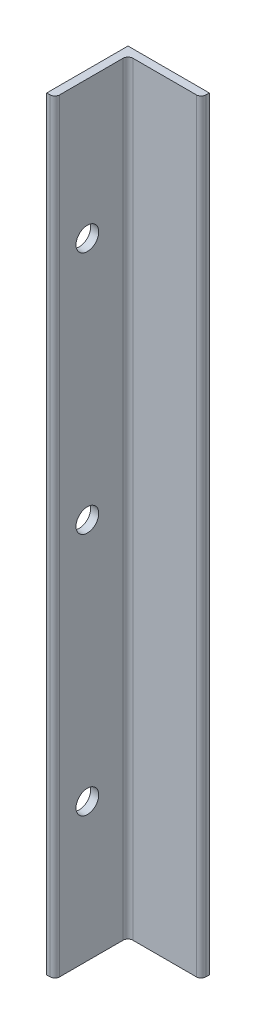
ISO-10303-21;
HEADER;
FILE_DESCRIPTION(('STEP AP214'),'2;1');
FILE_NAME('part.step','',(''),(''),'','','');
FILE_SCHEMA(('AUTOMOTIVE_DESIGN { 1 0 10303 214 1 1 1 1 }'));
ENDSEC;
DATA;
#1=APPLICATION_CONTEXT('core data for automotive mechanical design processes');
#2=APPLICATION_PROTOCOL_DEFINITION('international standard','automotive_design',2000,#1);
#3=PRODUCT_CONTEXT('',#1,'mechanical');
#4=PRODUCT('Part','Part','',(#3));
#5=PRODUCT_RELATED_PRODUCT_CATEGORY('part','',(#4));
#6=PRODUCT_DEFINITION_FORMATION('','',#4);
#7=PRODUCT_DEFINITION_CONTEXT('part definition',#1,'design');
#8=PRODUCT_DEFINITION('design','',#6,#7);
#9=PRODUCT_DEFINITION_SHAPE('','',#8);
#10=(LENGTH_UNIT() NAMED_UNIT(*) SI_UNIT(.MILLI.,.METRE.));
#11=(NAMED_UNIT(*) PLANE_ANGLE_UNIT() SI_UNIT($,.RADIAN.));
#12=(NAMED_UNIT(*) SI_UNIT($,.STERADIAN.) SOLID_ANGLE_UNIT());
#13=UNCERTAINTY_MEASURE_WITH_UNIT(LENGTH_MEASURE(1.E-05),#10,'distance_accuracy_value','');
#14=(GEOMETRIC_REPRESENTATION_CONTEXT(3) GLOBAL_UNCERTAINTY_ASSIGNED_CONTEXT((#13)) GLOBAL_UNIT_ASSIGNED_CONTEXT((#10,
#11,#12)) REPRESENTATION_CONTEXT('',''));
#15=CARTESIAN_POINT('',(0.,0.,0.));
#16=DIRECTION('',(0.,0.,1.));
#17=DIRECTION('',(1.,0.,0.));
#18=AXIS2_PLACEMENT_3D('',#15,#16,#17);
#19=CARTESIAN_POINT('',(-18.4998721449561,470.,-37.2131532770167));
#20=DIRECTION('',(-1.,0.,0.));
#21=DIRECTION('',(0.,0.,1.));
#22=AXIS2_PLACEMENT_3D('',#19,#20,#21);
#23=PLANE('',#22);
#24=DIRECTION('',(0.,0.,-1.));
#25=VECTOR('',#24,1.);
#26=CARTESIAN_POINT('',(-18.4998721449561,0.,-37.2131532770166));
#27=LINE('',#26,#25);
#28=CARTESIAN_POINT('',(-18.4998721449561,0.,-37.2131532770166));
#29=VERTEX_POINT('',#28);
#30=CARTESIAN_POINT('',(-18.4998721449561,0.,-39.2131532770166));
#31=VERTEX_POINT('',#30);
#32=EDGE_CURVE('E148',#29,#31,#27,.T.);
#33=ORIENTED_EDGE('',*,*,#32,.T.);
#34=DIRECTION('',(0.,-1.,0.));
#35=VECTOR('',#34,1.);
#36=CARTESIAN_POINT('',(-18.4998721449561,470.,-39.2131532770167));
#37=LINE('',#36,#35);
#38=CARTESIAN_POINT('',(-18.4998721449561,470.,-39.2131532770167));
#39=VERTEX_POINT('',#38);
#40=EDGE_CURVE('E13',#39,#31,#37,.T.);
#41=ORIENTED_EDGE('',*,*,#40,.F.);
#42=DIRECTION('',(0.,0.,-1.));
#43=VECTOR('',#42,1.);
#44=CARTESIAN_POINT('',(-18.4998721449561,470.,-37.2131532770167));
#45=LINE('',#44,#43);
#46=CARTESIAN_POINT('',(-18.4998721449561,470.,-37.2131532770167));
#47=VERTEX_POINT('',#46);
#48=EDGE_CURVE('E165',#47,#39,#45,.T.);
#49=ORIENTED_EDGE('',*,*,#48,.F.);
#50=DIRECTION('',(0.,-1.,0.));
#51=VECTOR('',#50,1.);
#52=CARTESIAN_POINT('',(-18.4998721449561,470.,-37.2131532770167));
#53=LINE('',#52,#51);
#54=EDGE_CURVE('E144',#47,#29,#53,.T.);
#55=ORIENTED_EDGE('',*,*,#54,.T.);
#56=EDGE_LOOP('',(#33,#41,#49,#55));
#57=FACE_BOUND('',#56,.T.);
#58=ADVANCED_FACE('F46',(#57),#23,.F.);
#59=CARTESIAN_POINT('',(-18.4998721449561,470.,-39.2131532770167));
#60=DIRECTION('',(0.,0.,1.));
#61=DIRECTION('',(1.,0.,0.));
#62=AXIS2_PLACEMENT_3D('',#59,#60,#61);
#63=PLANE('',#62);
#64=DIRECTION('',(-1.,0.,0.));
#65=VECTOR('',#64,1.);
#66=CARTESIAN_POINT('',(-18.4998721449561,0.,-39.2131532770166));
#67=LINE('',#66,#65);
#68=CARTESIAN_POINT('',(-68.4998721449561,0.,-39.2131532770166));
#69=VERTEX_POINT('',#68);
#70=EDGE_CURVE('E151',#31,#69,#67,.T.);
#71=ORIENTED_EDGE('',*,*,#70,.T.);
#72=DIRECTION('',(0.,-1.,0.));
#73=VECTOR('',#72,1.);
#74=CARTESIAN_POINT('',(-68.4998721449561,470.,-39.2131532770167));
#75=LINE('',#74,#73);
#76=CARTESIAN_POINT('',(-68.4998721449561,470.,-39.2131532770167));
#77=VERTEX_POINT('',#76);
#78=EDGE_CURVE('E54',#77,#69,#75,.T.);
#79=ORIENTED_EDGE('',*,*,#78,.F.);
#80=DIRECTION('',(-1.,0.,0.));
#81=VECTOR('',#80,1.);
#82=CARTESIAN_POINT('',(-18.4998721449561,470.,-39.2131532770167));
#83=LINE('',#82,#81);
#84=EDGE_CURVE('E108',#39,#77,#83,.T.);
#85=ORIENTED_EDGE('',*,*,#84,.F.);
#86=ORIENTED_EDGE('',*,*,#40,.T.);
#87=EDGE_LOOP('',(#71,#79,#85,#86));
#88=FACE_BOUND('',#87,.T.);
#89=ADVANCED_FACE('F248',(#88),#63,.F.);
#90=CARTESIAN_POINT('',(-68.4998721449561,470.,-39.2131532770167));
#91=DIRECTION('',(1.,0.,0.));
#92=DIRECTION('',(0.,0.,-1.));
#93=AXIS2_PLACEMENT_3D('',#90,#91,#92);
#94=PLANE('',#93);
#95=CARTESIAN_POINT('',(-68.4998721449561,385.,-9.21315327701661));
#96=DIRECTION('',(1.,0.,0.));
#97=DIRECTION('',(0.,0.,-1.));
#98=AXIS2_PLACEMENT_3D('',#95,#96,#97);
#99=CIRCLE('',#98,7.00000000000002);
#100=CARTESIAN_POINT('',(-68.4998721449561,385.,-16.2131532770166));
#101=VERTEX_POINT('',#100);
#102=EDGE_CURVE('E152',#101,#101,#99,.T.);
#103=ORIENTED_EDGE('',*,*,#102,.T.);
#104=EDGE_LOOP('',(#103));
#105=FACE_BOUND('',#104,.T.);
#106=CARTESIAN_POINT('',(-68.4998721449561,85.,-9.21315327701666));
#107=DIRECTION('',(1.,0.,0.));
#108=DIRECTION('',(0.,0.,-1.));
#109=AXIS2_PLACEMENT_3D('',#106,#107,#108);
#110=CIRCLE('',#109,7.);
#111=CARTESIAN_POINT('',(-68.4998721449561,85.,-16.2131532770167));
#112=VERTEX_POINT('',#111);
#113=EDGE_CURVE('E208',#112,#112,#110,.T.);
#114=ORIENTED_EDGE('',*,*,#113,.T.);
#115=EDGE_LOOP('',(#114));
#116=FACE_BOUND('',#115,.T.);
#117=CARTESIAN_POINT('',(-68.4998721449561,235.,-9.21315327701661));
#118=DIRECTION('',(1.,0.,0.));
#119=DIRECTION('',(0.,0.,-1.));
#120=AXIS2_PLACEMENT_3D('',#117,#118,#119);
#121=CIRCLE('',#120,7.00000000000002);
#122=CARTESIAN_POINT('',(-68.4998721449561,235.,-16.2131532770166));
#123=VERTEX_POINT('',#122);
#124=EDGE_CURVE('E211',#123,#123,#121,.T.);
#125=ORIENTED_EDGE('',*,*,#124,.T.);
#126=EDGE_LOOP('',(#125));
#127=FACE_BOUND('',#126,.T.);
#128=DIRECTION('',(0.,0.,1.));
#129=VECTOR('',#128,1.);
#130=CARTESIAN_POINT('',(-68.4998721449561,0.,-39.2131532770166));
#131=LINE('',#130,#129);
#132=CARTESIAN_POINT('',(-68.4998721449561,0.,10.7868467229834));
#133=VERTEX_POINT('',#132);
#134=EDGE_CURVE('E154',#69,#133,#131,.T.);
#135=ORIENTED_EDGE('',*,*,#134,.T.);
#136=DIRECTION('',(0.,-1.,0.));
#137=VECTOR('',#136,1.);
#138=CARTESIAN_POINT('',(-68.4998721449561,470.,10.7868467229834));
#139=LINE('',#138,#137);
#140=CARTESIAN_POINT('',(-68.4998721449561,470.,10.7868467229834));
#141=VERTEX_POINT('',#140);
#142=EDGE_CURVE('E175',#141,#133,#139,.T.);
#143=ORIENTED_EDGE('',*,*,#142,.F.);
#144=DIRECTION('',(0.,0.,1.));
#145=VECTOR('',#144,1.);
#146=CARTESIAN_POINT('',(-68.4998721449561,470.,-39.2131532770167));
#147=LINE('',#146,#145);
#148=EDGE_CURVE('E183',#77,#141,#147,.T.);
#149=ORIENTED_EDGE('',*,*,#148,.F.);
#150=ORIENTED_EDGE('',*,*,#78,.T.);
#151=EDGE_LOOP('',(#135,#143,#149,#150));
#152=FACE_BOUND('',#151,.T.);
#153=ADVANCED_FACE('F181',(#105,#116,#127,#152),#94,.F.);
#154=CARTESIAN_POINT('',(-68.4998721449561,470.,10.7868467229834));
#155=DIRECTION('',(0.,0.,-1.));
#156=DIRECTION('',(-1.,0.,0.));
#157=AXIS2_PLACEMENT_3D('',#154,#155,#156);
#158=PLANE('',#157);
#159=DIRECTION('',(1.,0.,0.));
#160=VECTOR('',#159,1.);
#161=CARTESIAN_POINT('',(-68.4998721449561,0.,10.7868467229834));
#162=LINE('',#161,#160);
#163=CARTESIAN_POINT('',(-66.4998721449561,0.,10.7868467229834));
#164=VERTEX_POINT('',#163);
#165=EDGE_CURVE('E156',#133,#164,#162,.T.);
#166=ORIENTED_EDGE('',*,*,#165,.T.);
#167=DIRECTION('',(0.,-1.,0.));
#168=VECTOR('',#167,1.);
#169=CARTESIAN_POINT('',(-66.4998721449561,470.,10.7868467229834));
#170=LINE('',#169,#168);
#171=CARTESIAN_POINT('',(-66.4998721449561,470.,10.7868467229834));
#172=VERTEX_POINT('',#171);
#173=EDGE_CURVE('E172',#172,#164,#170,.T.);
#174=ORIENTED_EDGE('',*,*,#173,.F.);
#175=DIRECTION('',(1.,0.,0.));
#176=VECTOR('',#175,1.);
#177=CARTESIAN_POINT('',(-68.4998721449561,470.,10.7868467229834));
#178=LINE('',#177,#176);
#179=EDGE_CURVE('E199',#141,#172,#178,.T.);
#180=ORIENTED_EDGE('',*,*,#179,.F.);
#181=ORIENTED_EDGE('',*,*,#142,.T.);
#182=EDGE_LOOP('',(#166,#174,#180,#181));
#183=FACE_BOUND('',#182,.T.);
#184=ADVANCED_FACE('F192',(#183),#158,.F.);
#185=CARTESIAN_POINT('',(-66.4998721449561,470.,7.78684672298335));
#186=DIRECTION('',(0.,-1.,0.));
#187=DIRECTION('',(0.,0.,-1.));
#188=AXIS2_PLACEMENT_3D('',#185,#186,#187);
#189=CYLINDRICAL_SURFACE('',#188,3.);
#190=CARTESIAN_POINT('',(-66.4998721449561,0.,7.78684672298335));
#191=DIRECTION('',(0.,1.,0.));
#192=DIRECTION('',(0.,0.,1.));
#193=AXIS2_PLACEMENT_3D('',#190,#191,#192);
#194=CIRCLE('',#193,3.);
#195=CARTESIAN_POINT('',(-63.4998721449561,0.,7.78684672298335));
#196=VERTEX_POINT('',#195);
#197=EDGE_CURVE('E158',#164,#196,#194,.T.);
#198=ORIENTED_EDGE('',*,*,#197,.T.);
#199=DIRECTION('',(0.,-1.,0.));
#200=VECTOR('',#199,1.);
#201=CARTESIAN_POINT('',(-63.4998721449561,470.,7.78684672298335));
#202=LINE('',#201,#200);
#203=CARTESIAN_POINT('',(-63.4998721449561,470.,7.78684672298335));
#204=VERTEX_POINT('',#203);
#205=EDGE_CURVE('E169',#204,#196,#202,.T.);
#206=ORIENTED_EDGE('',*,*,#205,.F.);
#207=CARTESIAN_POINT('',(-66.4998721449561,470.,7.78684672298335));
#208=DIRECTION('',(0.,1.,0.));
#209=DIRECTION('',(0.,0.,1.));
#210=AXIS2_PLACEMENT_3D('',#207,#208,#209);
#211=CIRCLE('',#210,3.);
#212=EDGE_CURVE('E198',#172,#204,#211,.T.);
#213=ORIENTED_EDGE('',*,*,#212,.F.);
#214=ORIENTED_EDGE('',*,*,#173,.T.);
#215=EDGE_LOOP('',(#198,#206,#213,#214));
#216=FACE_BOUND('',#215,.T.);
#217=ADVANCED_FACE('F196',(#216),#189,.T.);
#218=CARTESIAN_POINT('',(-63.4998721449561,470.,7.78684672298335));
#219=DIRECTION('',(-1.,0.,0.));
#220=DIRECTION('',(0.,0.,1.));
#221=AXIS2_PLACEMENT_3D('',#218,#219,#220);
#222=PLANE('',#221);
#223=CARTESIAN_POINT('',(-63.4998721449561,385.,-9.21315327701661));
#224=DIRECTION('',(1.,0.,0.));
#225=DIRECTION('',(0.,0.,-1.));
#226=AXIS2_PLACEMENT_3D('',#223,#224,#225);
#227=CIRCLE('',#226,7.00000000000002);
#228=CARTESIAN_POINT('',(-63.4998721449561,385.,-16.2131532770166));
#229=VERTEX_POINT('',#228);
#230=EDGE_CURVE('E218',#229,#229,#227,.T.);
#231=ORIENTED_EDGE('',*,*,#230,.F.);
#232=EDGE_LOOP('',(#231));
#233=FACE_BOUND('',#232,.T.);
#234=CARTESIAN_POINT('',(-63.4998721449561,85.,-9.21315327701666));
#235=DIRECTION('',(1.,0.,0.));
#236=DIRECTION('',(0.,0.,-1.));
#237=AXIS2_PLACEMENT_3D('',#234,#235,#236);
#238=CIRCLE('',#237,7.);
#239=CARTESIAN_POINT('',(-63.4998721449561,85.,-16.2131532770167));
#240=VERTEX_POINT('',#239);
#241=EDGE_CURVE('E217',#240,#240,#238,.T.);
#242=ORIENTED_EDGE('',*,*,#241,.F.);
#243=EDGE_LOOP('',(#242));
#244=FACE_BOUND('',#243,.T.);
#245=CARTESIAN_POINT('',(-63.4998721449561,235.,-9.21315327701661));
#246=DIRECTION('',(1.,0.,0.));
#247=DIRECTION('',(0.,0.,-1.));
#248=AXIS2_PLACEMENT_3D('',#245,#246,#247);
#249=CIRCLE('',#248,7.00000000000002);
#250=CARTESIAN_POINT('',(-63.4998721449561,235.,-16.2131532770166));
#251=VERTEX_POINT('',#250);
#252=EDGE_CURVE('E214',#251,#251,#249,.T.);
#253=ORIENTED_EDGE('',*,*,#252,.F.);
#254=EDGE_LOOP('',(#253));
#255=FACE_BOUND('',#254,.T.);
#256=DIRECTION('',(0.,0.,-1.));
#257=VECTOR('',#256,1.);
#258=CARTESIAN_POINT('',(-63.4998721449561,0.,7.78684672298335));
#259=LINE('',#258,#257);
#260=CARTESIAN_POINT('',(-63.4998721449561,0.,-31.2131532770166));
#261=VERTEX_POINT('',#260);
#262=EDGE_CURVE('E160',#196,#261,#259,.T.);
#263=ORIENTED_EDGE('',*,*,#262,.T.);
#264=DIRECTION('',(0.,-1.,0.));
#265=VECTOR('',#264,1.);
#266=CARTESIAN_POINT('',(-63.4998721449561,470.,-31.2131532770167));
#267=LINE('',#266,#265);
#268=CARTESIAN_POINT('',(-63.4998721449561,470.,-31.2131532770167));
#269=VERTEX_POINT('',#268);
#270=EDGE_CURVE('E139',#269,#261,#267,.T.);
#271=ORIENTED_EDGE('',*,*,#270,.F.);
#272=DIRECTION('',(0.,0.,-1.));
#273=VECTOR('',#272,1.);
#274=CARTESIAN_POINT('',(-63.4998721449561,470.,7.78684672298335));
#275=LINE('',#274,#273);
#276=EDGE_CURVE('E130',#204,#269,#275,.T.);
#277=ORIENTED_EDGE('',*,*,#276,.F.);
#278=ORIENTED_EDGE('',*,*,#205,.T.);
#279=EDGE_LOOP('',(#263,#271,#277,#278));
#280=FACE_BOUND('',#279,.T.);
#281=ADVANCED_FACE('F227',(#233,#244,#255,#280),#222,.F.);
#282=CARTESIAN_POINT('',(-60.4998721449561,470.,-31.2131532770167));
#283=DIRECTION('',(0.,-1.,0.));
#284=DIRECTION('',(0.,0.,-1.));
#285=AXIS2_PLACEMENT_3D('',#282,#283,#284);
#286=CYLINDRICAL_SURFACE('',#285,3.);
#287=CARTESIAN_POINT('',(-60.4998721449561,0.,-31.2131532770166));
#288=DIRECTION('',(0.,-1.,0.));
#289=DIRECTION('',(0.,0.,-1.));
#290=AXIS2_PLACEMENT_3D('',#287,#288,#289);
#291=CIRCLE('',#290,3.);
#292=CARTESIAN_POINT('',(-60.4998721449561,0.,-34.2131532770167));
#293=VERTEX_POINT('',#292);
#294=EDGE_CURVE('E138',#261,#293,#291,.T.);
#295=ORIENTED_EDGE('',*,*,#294,.T.);
#296=DIRECTION('',(0.,-1.,0.));
#297=VECTOR('',#296,1.);
#298=CARTESIAN_POINT('',(-60.4998721449561,470.,-34.2131532770167));
#299=LINE('',#298,#297);
#300=CARTESIAN_POINT('',(-60.4998721449561,470.,-34.2131532770167));
#301=VERTEX_POINT('',#300);
#302=EDGE_CURVE('E135',#301,#293,#299,.T.);
#303=ORIENTED_EDGE('',*,*,#302,.F.);
#304=CARTESIAN_POINT('',(-60.4998721449561,470.,-31.2131532770167));
#305=DIRECTION('',(0.,-1.,0.));
#306=DIRECTION('',(0.,0.,-1.));
#307=AXIS2_PLACEMENT_3D('',#304,#305,#306);
#308=CIRCLE('',#307,3.);
#309=EDGE_CURVE('E124',#269,#301,#308,.T.);
#310=ORIENTED_EDGE('',*,*,#309,.F.);
#311=ORIENTED_EDGE('',*,*,#270,.T.);
#312=EDGE_LOOP('',(#295,#303,#310,#311));
#313=FACE_BOUND('',#312,.T.);
#314=ADVANCED_FACE('F136',(#313),#286,.F.);
#315=CARTESIAN_POINT('',(-60.4998721449561,470.,-34.2131532770167));
#316=DIRECTION('',(0.,0.,-1.));
#317=DIRECTION('',(-1.,0.,0.));
#318=AXIS2_PLACEMENT_3D('',#315,#316,#317);
#319=PLANE('',#318);
#320=DIRECTION('',(1.,0.,0.));
#321=VECTOR('',#320,1.);
#322=CARTESIAN_POINT('',(-60.4998721449561,0.,-34.2131532770167));
#323=LINE('',#322,#321);
#324=CARTESIAN_POINT('',(-21.4998721449561,0.,-34.2131532770167));
#325=VERTEX_POINT('',#324);
#326=EDGE_CURVE('E94',#293,#325,#323,.T.);
#327=ORIENTED_EDGE('',*,*,#326,.T.);
#328=DIRECTION('',(0.,-1.,0.));
#329=VECTOR('',#328,1.);
#330=CARTESIAN_POINT('',(-21.4998721449561,470.,-34.2131532770167));
#331=LINE('',#330,#329);
#332=CARTESIAN_POINT('',(-21.4998721449561,470.,-34.2131532770167));
#333=VERTEX_POINT('',#332);
#334=EDGE_CURVE('E140',#333,#325,#331,.T.);
#335=ORIENTED_EDGE('',*,*,#334,.F.);
#336=DIRECTION('',(1.,0.,0.));
#337=VECTOR('',#336,1.);
#338=CARTESIAN_POINT('',(-60.4998721449561,470.,-34.2131532770167));
#339=LINE('',#338,#337);
#340=EDGE_CURVE('E128',#301,#333,#339,.T.);
#341=ORIENTED_EDGE('',*,*,#340,.F.);
#342=ORIENTED_EDGE('',*,*,#302,.T.);
#343=EDGE_LOOP('',(#327,#335,#341,#342));
#344=FACE_BOUND('',#343,.T.);
#345=ADVANCED_FACE('F142',(#344),#319,.F.);
#346=CARTESIAN_POINT('',(-21.4998721449561,470.,-37.2131532770167));
#347=DIRECTION('',(0.,-1.,0.));
#348=DIRECTION('',(0.,0.,-1.));
#349=AXIS2_PLACEMENT_3D('',#346,#347,#348);
#350=CYLINDRICAL_SURFACE('',#349,3.);
#351=CARTESIAN_POINT('',(-21.4998721449561,0.,-37.2131532770166));
#352=DIRECTION('',(0.,1.,0.));
#353=DIRECTION('',(0.,0.,1.));
#354=AXIS2_PLACEMENT_3D('',#351,#352,#353);
#355=CIRCLE('',#354,3.);
#356=EDGE_CURVE('E100',#325,#29,#355,.T.);
#357=ORIENTED_EDGE('',*,*,#356,.T.);
#358=ORIENTED_EDGE('',*,*,#54,.F.);
#359=CARTESIAN_POINT('',(-21.4998721449561,470.,-37.2131532770167));
#360=DIRECTION('',(0.,1.,0.));
#361=DIRECTION('',(0.,0.,1.));
#362=AXIS2_PLACEMENT_3D('',#359,#360,#361);
#363=CIRCLE('',#362,3.);
#364=EDGE_CURVE('E62',#333,#47,#363,.T.);
#365=ORIENTED_EDGE('',*,*,#364,.F.);
#366=ORIENTED_EDGE('',*,*,#334,.T.);
#367=EDGE_LOOP('',(#357,#358,#365,#366));
#368=FACE_BOUND('',#367,.T.);
#369=ADVANCED_FACE('F237',(#368),#350,.T.);
#370=CARTESIAN_POINT('',(-66.4998721449561,470.,7.78684672298335));
#371=DIRECTION('',(0.,1.,0.));
#372=DIRECTION('',(0.,0.,1.));
#373=AXIS2_PLACEMENT_3D('',#370,#371,#372);
#374=PLANE('',#373);
#375=ORIENTED_EDGE('',*,*,#48,.T.);
#376=ORIENTED_EDGE('',*,*,#84,.T.);
#377=ORIENTED_EDGE('',*,*,#148,.T.);
#378=ORIENTED_EDGE('',*,*,#179,.T.);
#379=ORIENTED_EDGE('',*,*,#212,.T.);
#380=ORIENTED_EDGE('',*,*,#276,.T.);
#381=ORIENTED_EDGE('',*,*,#309,.T.);
#382=ORIENTED_EDGE('',*,*,#340,.T.);
#383=ORIENTED_EDGE('',*,*,#364,.T.);
#384=EDGE_LOOP('',(#375,#376,#377,#378,#379,#380,#381,#382,#383));
#385=FACE_BOUND('',#384,.T.);
#386=ADVANCED_FACE('F126',(#385),#374,.T.);
#387=CARTESIAN_POINT('',(-66.4998721449561,0.,7.78684672298335));
#388=DIRECTION('',(0.,1.,0.));
#389=DIRECTION('',(0.,0.,1.));
#390=AXIS2_PLACEMENT_3D('',#387,#388,#389);
#391=PLANE('',#390);
#392=ORIENTED_EDGE('',*,*,#32,.F.);
#393=ORIENTED_EDGE('',*,*,#356,.F.);
#394=ORIENTED_EDGE('',*,*,#326,.F.);
#395=ORIENTED_EDGE('',*,*,#294,.F.);
#396=ORIENTED_EDGE('',*,*,#262,.F.);
#397=ORIENTED_EDGE('',*,*,#197,.F.);
#398=ORIENTED_EDGE('',*,*,#165,.F.);
#399=ORIENTED_EDGE('',*,*,#134,.F.);
#400=ORIENTED_EDGE('',*,*,#70,.F.);
#401=EDGE_LOOP('',(#392,#393,#394,#395,#396,#397,#398,#399,#400));
#402=FACE_BOUND('',#401,.T.);
#403=ADVANCED_FACE('F187',(#402),#391,.F.);
#404=CARTESIAN_POINT('',(-73.4998721449561,235.,-9.21315327701661));
#405=DIRECTION('',(1.,0.,0.));
#406=DIRECTION('',(0.,0.,-1.));
#407=AXIS2_PLACEMENT_3D('',#404,#405,#406);
#408=CYLINDRICAL_SURFACE('',#407,7.00000000000002);
#409=ORIENTED_EDGE('',*,*,#252,.T.);
#410=EDGE_LOOP('',(#409));
#411=FACE_BOUND('',#410,.T.);
#412=ORIENTED_EDGE('',*,*,#124,.F.);
#413=EDGE_LOOP('',(#412));
#414=FACE_BOUND('',#413,.T.);
#415=ADVANCED_FACE('F284',(#411,#414),#408,.F.);
#416=CARTESIAN_POINT('',(-73.4998721449561,85.,-9.21315327701666));
#417=DIRECTION('',(1.,0.,0.));
#418=DIRECTION('',(0.,0.,-1.));
#419=AXIS2_PLACEMENT_3D('',#416,#417,#418);
#420=CYLINDRICAL_SURFACE('',#419,7.);
#421=ORIENTED_EDGE('',*,*,#241,.T.);
#422=EDGE_LOOP('',(#421));
#423=FACE_BOUND('',#422,.T.);
#424=ORIENTED_EDGE('',*,*,#113,.F.);
#425=EDGE_LOOP('',(#424));
#426=FACE_BOUND('',#425,.T.);
#427=ADVANCED_FACE('F224',(#423,#426),#420,.F.);
#428=CARTESIAN_POINT('',(-73.4998721449561,385.,-9.21315327701661));
#429=DIRECTION('',(1.,0.,0.));
#430=DIRECTION('',(0.,0.,-1.));
#431=AXIS2_PLACEMENT_3D('',#428,#429,#430);
#432=CYLINDRICAL_SURFACE('',#431,7.00000000000002);
#433=ORIENTED_EDGE('',*,*,#230,.T.);
#434=EDGE_LOOP('',(#433));
#435=FACE_BOUND('',#434,.T.);
#436=ORIENTED_EDGE('',*,*,#102,.F.);
#437=EDGE_LOOP('',(#436));
#438=FACE_BOUND('',#437,.T.);
#439=ADVANCED_FACE('F297',(#435,#438),#432,.F.);
#440=CLOSED_SHELL('',(#58,#89,#153,#184,#217,#281,#314,#345,#369,#386,#403,#415,#427,#439));
#441=MANIFOLD_SOLID_BREP('B2',#440);
#442=ADVANCED_BREP_SHAPE_REPRESENTATION('',(#18,#441),#14);
#443=SHAPE_DEFINITION_REPRESENTATION(#9,#442);
ENDSEC;
END-ISO-10303-21;
